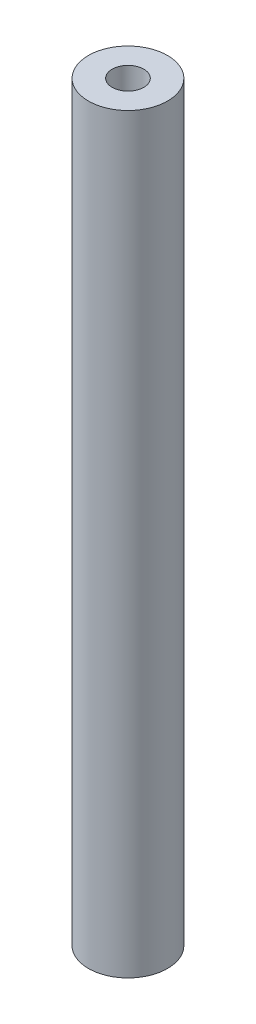
ISO-10303-21;
HEADER;
FILE_DESCRIPTION(('STEP AP214'),'2;1');
FILE_NAME('part.step','',(''),(''),'','','');
FILE_SCHEMA(('AUTOMOTIVE_DESIGN { 1 0 10303 214 1 1 1 1 }'));
ENDSEC;
DATA;
#1=APPLICATION_CONTEXT('core data for automotive mechanical design processes');
#2=APPLICATION_PROTOCOL_DEFINITION('international standard','automotive_design',2000,#1);
#3=PRODUCT_CONTEXT('',#1,'mechanical');
#4=PRODUCT('Part','Part','',(#3));
#5=PRODUCT_RELATED_PRODUCT_CATEGORY('part','',(#4));
#6=PRODUCT_DEFINITION_FORMATION('','',#4);
#7=PRODUCT_DEFINITION_CONTEXT('part definition',#1,'design');
#8=PRODUCT_DEFINITION('design','',#6,#7);
#9=PRODUCT_DEFINITION_SHAPE('','',#8);
#10=(LENGTH_UNIT() NAMED_UNIT(*) SI_UNIT(.MILLI.,.METRE.));
#11=(NAMED_UNIT(*) PLANE_ANGLE_UNIT() SI_UNIT($,.RADIAN.));
#12=(NAMED_UNIT(*) SI_UNIT($,.STERADIAN.) SOLID_ANGLE_UNIT());
#13=UNCERTAINTY_MEASURE_WITH_UNIT(LENGTH_MEASURE(1.E-05),#10,'distance_accuracy_value','');
#14=(GEOMETRIC_REPRESENTATION_CONTEXT(3) GLOBAL_UNCERTAINTY_ASSIGNED_CONTEXT((#13)) GLOBAL_UNIT_ASSIGNED_CONTEXT((#10,
#11,#12)) REPRESENTATION_CONTEXT('',''));
#15=CARTESIAN_POINT('',(0.,0.,0.));
#16=DIRECTION('',(0.,0.,1.));
#17=DIRECTION('',(1.,0.,0.));
#18=AXIS2_PLACEMENT_3D('',#15,#16,#17);
#19=CARTESIAN_POINT('',(-5.,99.,0.));
#20=DIRECTION('',(0.,-1.,0.));
#21=DIRECTION('',(1.,0.,0.));
#22=AXIS2_PLACEMENT_3D('',#19,#20,#21);
#23=PLANE('',#22);
#24=CARTESIAN_POINT('',(0.,99.,0.));
#25=DIRECTION('',(0.,1.,0.));
#26=DIRECTION('',(-1.,0.,0.));
#27=AXIS2_PLACEMENT_3D('',#24,#25,#26);
#28=CIRCLE('',#27,4.99999999999999);
#29=CARTESIAN_POINT('',(-5.,99.,0.));
#30=VERTEX_POINT('',#29);
#31=EDGE_CURVE('E60',#30,#30,#28,.T.);
#32=ORIENTED_EDGE('',*,*,#31,.T.);
#33=EDGE_LOOP('',(#32));
#34=FACE_BOUND('',#33,.T.);
#35=CARTESIAN_POINT('',(0.,99.,0.));
#36=DIRECTION('',(0.,1.,0.));
#37=DIRECTION('',(-1.,0.,0.));
#38=AXIS2_PLACEMENT_3D('',#35,#36,#37);
#39=CIRCLE('',#38,2.);
#40=CARTESIAN_POINT('',(-2.,99.,0.));
#41=VERTEX_POINT('',#40);
#42=EDGE_CURVE('E67',#41,#41,#39,.F.);
#43=ORIENTED_EDGE('',*,*,#42,.T.);
#44=EDGE_LOOP('',(#43));
#45=FACE_BOUND('',#44,.T.);
#46=ADVANCED_FACE('F36',(#34,#45),#23,.F.);
#47=CARTESIAN_POINT('',(0.,103.,0.));
#48=DIRECTION('',(0.,-1.,0.));
#49=DIRECTION('',(0.,0.,-1.));
#50=AXIS2_PLACEMENT_3D('',#47,#48,#49);
#51=CYLINDRICAL_SURFACE('',#50,5.);
#52=ORIENTED_EDGE('',*,*,#31,.F.);
#53=EDGE_LOOP('',(#52));
#54=FACE_BOUND('',#53,.T.);
#55=CARTESIAN_POINT('',(0.,4.,0.));
#56=DIRECTION('',(0.,1.,0.));
#57=DIRECTION('',(-1.,0.,0.));
#58=AXIS2_PLACEMENT_3D('',#55,#56,#57);
#59=CIRCLE('',#58,4.99999999999999);
#60=CARTESIAN_POINT('',(-4.99999999999999,4.,0.));
#61=VERTEX_POINT('',#60);
#62=EDGE_CURVE('E63',#61,#61,#59,.T.);
#63=ORIENTED_EDGE('',*,*,#62,.T.);
#64=EDGE_LOOP('',(#63));
#65=FACE_BOUND('',#64,.T.);
#66=ADVANCED_FACE('F38',(#54,#65),#51,.T.);
#67=CARTESIAN_POINT('',(-4.99999999999999,4.,0.));
#68=DIRECTION('',(0.,1.,0.));
#69=DIRECTION('',(-1.,0.,0.));
#70=AXIS2_PLACEMENT_3D('',#67,#68,#69);
#71=PLANE('',#70);
#72=ORIENTED_EDGE('',*,*,#62,.F.);
#73=EDGE_LOOP('',(#72));
#74=FACE_BOUND('',#73,.T.);
#75=CARTESIAN_POINT('',(0.,4.,0.));
#76=DIRECTION('',(0.,-1.,0.));
#77=DIRECTION('',(1.,0.,0.));
#78=AXIS2_PLACEMENT_3D('',#75,#76,#77);
#79=CIRCLE('',#78,2.);
#80=CARTESIAN_POINT('',(2.,4.,0.));
#81=VERTEX_POINT('',#80);
#82=EDGE_CURVE('E40',#81,#81,#79,.F.);
#83=ORIENTED_EDGE('',*,*,#82,.T.);
#84=EDGE_LOOP('',(#83));
#85=FACE_BOUND('',#84,.T.);
#86=ADVANCED_FACE('F75',(#74,#85),#71,.F.);
#87=CARTESIAN_POINT('',(0.,85.,0.));
#88=DIRECTION('',(0.,1.,0.));
#89=DIRECTION('',(0.,0.,1.));
#90=AXIS2_PLACEMENT_3D('',#87,#88,#89);
#91=CONICAL_SURFACE('',#90,2.,1.02974425867665);
#92=CARTESIAN_POINT('',(0.,83.7982787619449,0.));
#93=VERTEX_POINT('',#92);
#94=VERTEX_LOOP('',#93);
#95=FACE_BOUND('',#94,.T.);
#96=CARTESIAN_POINT('',(0.,85.,0.));
#97=DIRECTION('',(0.,1.,0.));
#98=DIRECTION('',(0.,0.,1.));
#99=AXIS2_PLACEMENT_3D('',#96,#97,#98);
#100=CIRCLE('',#99,2.);
#101=CARTESIAN_POINT('',(0.,85.,2.));
#102=VERTEX_POINT('',#101);
#103=EDGE_CURVE('E11',#102,#102,#100,.T.);
#104=ORIENTED_EDGE('',*,*,#103,.T.);
#105=EDGE_LOOP('',(#104));
#106=FACE_BOUND('',#105,.T.);
#107=ADVANCED_FACE('F90',(#95,#106),#91,.F.);
#108=CARTESIAN_POINT('',(0.,103.,0.));
#109=DIRECTION('',(0.,1.,0.));
#110=DIRECTION('',(0.,0.,1.));
#111=AXIS2_PLACEMENT_3D('',#108,#109,#110);
#112=CYLINDRICAL_SURFACE('',#111,2.);
#113=ORIENTED_EDGE('',*,*,#103,.F.);
#114=EDGE_LOOP('',(#113));
#115=FACE_BOUND('',#114,.T.);
#116=ORIENTED_EDGE('',*,*,#42,.F.);
#117=EDGE_LOOP('',(#116));
#118=FACE_BOUND('',#117,.T.);
#119=ADVANCED_FACE('F55',(#115,#118),#112,.F.);
#120=CARTESIAN_POINT('',(0.,18.,0.));
#121=DIRECTION('',(0.,-1.,0.));
#122=DIRECTION('',(0.,0.,-1.));
#123=AXIS2_PLACEMENT_3D('',#120,#121,#122);
#124=CONICAL_SURFACE('',#123,2.,1.02974425867665);
#125=CARTESIAN_POINT('',(0.,19.2017212380551,0.));
#126=VERTEX_POINT('',#125);
#127=VERTEX_LOOP('',#126);
#128=FACE_BOUND('',#127,.T.);
#129=CARTESIAN_POINT('',(0.,18.,0.));
#130=DIRECTION('',(0.,-1.,0.));
#131=DIRECTION('',(0.,0.,-1.));
#132=AXIS2_PLACEMENT_3D('',#129,#130,#131);
#133=CIRCLE('',#132,2.);
#134=CARTESIAN_POINT('',(0.,18.,-2.));
#135=VERTEX_POINT('',#134);
#136=EDGE_CURVE('E45',#135,#135,#133,.T.);
#137=ORIENTED_EDGE('',*,*,#136,.T.);
#138=EDGE_LOOP('',(#137));
#139=FACE_BOUND('',#138,.T.);
#140=ADVANCED_FACE('F51',(#128,#139),#124,.F.);
#141=CARTESIAN_POINT('',(0.,0.,0.));
#142=DIRECTION('',(0.,-1.,0.));
#143=DIRECTION('',(0.,0.,-1.));
#144=AXIS2_PLACEMENT_3D('',#141,#142,#143);
#145=CYLINDRICAL_SURFACE('',#144,2.);
#146=ORIENTED_EDGE('',*,*,#136,.F.);
#147=EDGE_LOOP('',(#146));
#148=FACE_BOUND('',#147,.T.);
#149=ORIENTED_EDGE('',*,*,#82,.F.);
#150=EDGE_LOOP('',(#149));
#151=FACE_BOUND('',#150,.T.);
#152=ADVANCED_FACE('F54',(#148,#151),#145,.F.);
#153=CLOSED_SHELL('',(#46,#66,#86,#107,#119,#140,#152));
#154=MANIFOLD_SOLID_BREP('B2',#153);
#155=ADVANCED_BREP_SHAPE_REPRESENTATION('',(#18,#154),#14);
#156=SHAPE_DEFINITION_REPRESENTATION(#9,#155);
ENDSEC;
END-ISO-10303-21;
